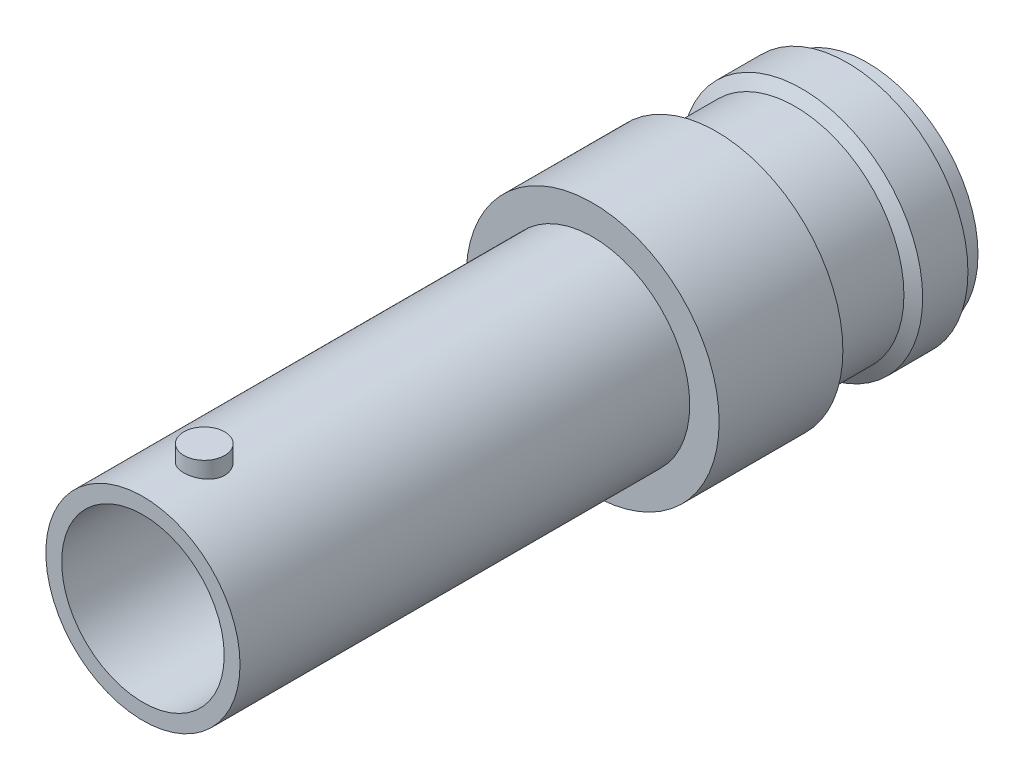
ISO-10303-21;
HEADER;
FILE_DESCRIPTION(('STEP AP214'),'2;1');
FILE_NAME('part.step','',(''),(''),'','','');
FILE_SCHEMA(('AUTOMOTIVE_DESIGN { 1 0 10303 214 1 1 1 1 }'));
ENDSEC;
DATA;
#1=APPLICATION_CONTEXT('core data for automotive mechanical design processes');
#2=APPLICATION_PROTOCOL_DEFINITION('international standard','automotive_design',2000,#1);
#3=PRODUCT_CONTEXT('',#1,'mechanical');
#4=PRODUCT('Part','Part','',(#3));
#5=PRODUCT_RELATED_PRODUCT_CATEGORY('part','',(#4));
#6=PRODUCT_DEFINITION_FORMATION('','',#4);
#7=PRODUCT_DEFINITION_CONTEXT('part definition',#1,'design');
#8=PRODUCT_DEFINITION('design','',#6,#7);
#9=PRODUCT_DEFINITION_SHAPE('','',#8);
#10=(LENGTH_UNIT() NAMED_UNIT(*) SI_UNIT(.MILLI.,.METRE.));
#11=(NAMED_UNIT(*) PLANE_ANGLE_UNIT() SI_UNIT($,.RADIAN.));
#12=(NAMED_UNIT(*) SI_UNIT($,.STERADIAN.) SOLID_ANGLE_UNIT());
#13=UNCERTAINTY_MEASURE_WITH_UNIT(LENGTH_MEASURE(1.E-05),#10,'distance_accuracy_value','');
#14=(GEOMETRIC_REPRESENTATION_CONTEXT(3) GLOBAL_UNCERTAINTY_ASSIGNED_CONTEXT((#13)) GLOBAL_UNIT_ASSIGNED_CONTEXT((#10,
#11,#12)) REPRESENTATION_CONTEXT('',''));
#15=CARTESIAN_POINT('',(0.,0.,0.));
#16=DIRECTION('',(0.,0.,1.));
#17=DIRECTION('',(1.,0.,0.));
#18=AXIS2_PLACEMENT_3D('',#15,#16,#17);
#19=CARTESIAN_POINT('',(0.,125.,108.947));
#20=DIRECTION('',(0.,0.,-1.));
#21=DIRECTION('',(0.00295311214486117,-0.999995639554823,0.));
#22=AXIS2_PLACEMENT_3D('',#19,#20,#21);
#23=TOROIDAL_SURFACE('',#22,5.548399999994,0.2286);
#24=CARTESIAN_POINT('',(0.,125.,109.1756));
#25=DIRECTION('',(0.,0.,1.));
#26=DIRECTION('',(-3.04320661187128E-12,-1.,0.));
#27=AXIS2_PLACEMENT_3D('',#24,#25,#26);
#28=CIRCLE('',#27,5.54839999999403);
#29=CARTESIAN_POINT('',(6.75102606196437E-12,130.548399999996,109.1756));
#30=VERTEX_POINT('',#29);
#31=CARTESIAN_POINT('',(-3.36996733686992E-12,119.451600000004,109.1756));
#32=VERTEX_POINT('',#31);
#33=EDGE_CURVE('E37',#30,#32,#28,.F.);
#34=ORIENTED_EDGE('',*,*,#33,.F.);
#35=CARTESIAN_POINT('',(0.,125.,109.1756));
#36=DIRECTION('',(0.,0.,1.));
#37=DIRECTION('',(3.04325363193974E-12,1.,0.));
#38=AXIS2_PLACEMENT_3D('',#35,#36,#37);
#39=CIRCLE('',#38,5.54839999999401);
#40=EDGE_CURVE('E34',#32,#30,#39,.F.);
#41=ORIENTED_EDGE('',*,*,#40,.F.);
#42=EDGE_LOOP('',(#34,#41));
#43=FACE_BOUND('',#42,.T.);
#44=CARTESIAN_POINT('',(0.,125.,108.946999999992));
#45=DIRECTION('',(0.,0.,-1.));
#46=DIRECTION('',(0.,1.,0.));
#47=AXIS2_PLACEMENT_3D('',#44,#45,#46);
#48=CIRCLE('',#47,5.77699999999998);
#49=CARTESIAN_POINT('',(0.,130.777,108.946999999992));
#50=VERTEX_POINT('',#49);
#51=EDGE_CURVE('E44',#50,#50,#48,.F.);
#52=ORIENTED_EDGE('',*,*,#51,.F.);
#53=EDGE_LOOP('',(#52));
#54=FACE_BOUND('',#53,.T.);
#55=ADVANCED_FACE('F16',(#43,#54),#23,.F.);
#56=CARTESIAN_POINT('',(-5.776118093564,119.229664,109.1756));
#57=DIRECTION('',(0.,0.,-1.));
#58=DIRECTION('',(0.,1.,0.));
#59=AXIS2_PLACEMENT_3D('',#56,#57,#58);
#60=PLANE('',#59);
#61=CARTESIAN_POINT('',(0.,125.,109.175599999977));
#62=DIRECTION('',(0.,0.,1.));
#63=DIRECTION('',(1.,0.,0.));
#64=AXIS2_PLACEMENT_3D('',#61,#62,#63);
#65=CIRCLE('',#64,5.41);
#66=CARTESIAN_POINT('',(5.41,125.,109.175599999977));
#67=VERTEX_POINT('',#66);
#68=EDGE_CURVE('E163',#67,#67,#65,.T.);
#69=ORIENTED_EDGE('',*,*,#68,.T.);
#70=EDGE_LOOP('',(#69));
#71=FACE_BOUND('',#70,.T.);
#72=ORIENTED_EDGE('',*,*,#33,.T.);
#73=ORIENTED_EDGE('',*,*,#40,.T.);
#74=EDGE_LOOP('',(#72,#73));
#75=FACE_BOUND('',#74,.T.);
#76=ADVANCED_FACE('F43',(#71,#75),#60,.T.);
#77=CARTESIAN_POINT('',(0.,125.,108.946999999992));
#78=DIRECTION('',(0.,0.,-1.));
#79=DIRECTION('',(-1.,0.,0.));
#80=AXIS2_PLACEMENT_3D('',#77,#78,#79);
#81=CYLINDRICAL_SURFACE('',#80,5.77699999999998);
#82=CARTESIAN_POINT('',(0.,125.,108.667600000008));
#83=DIRECTION('',(0.,0.,-1.));
#84=DIRECTION('',(-1.,0.,0.));
#85=AXIS2_PLACEMENT_3D('',#82,#83,#84);
#86=CIRCLE('',#85,5.77699999999998);
#87=CARTESIAN_POINT('',(-5.77699999999998,125.,108.667600000008));
#88=VERTEX_POINT('',#87);
#89=EDGE_CURVE('E160',#88,#88,#86,.T.);
#90=ORIENTED_EDGE('',*,*,#89,.T.);
#91=EDGE_LOOP('',(#90));
#92=FACE_BOUND('',#91,.T.);
#93=ORIENTED_EDGE('',*,*,#51,.T.);
#94=EDGE_LOOP('',(#93));
#95=FACE_BOUND('',#94,.T.);
#96=ADVANCED_FACE('F61',(#92,#95),#81,.F.);
#97=CARTESIAN_POINT('',(0.,125.,104.758236658823));
#98=DIRECTION('',(0.,0.,1.));
#99=DIRECTION('',(1.,0.,0.));
#100=AXIS2_PLACEMENT_3D('',#97,#98,#99);
#101=CYLINDRICAL_SURFACE('',#100,5.41);
#102=ORIENTED_EDGE('',*,*,#68,.F.);
#103=EDGE_LOOP('',(#102));
#104=FACE_BOUND('',#103,.T.);
#105=CARTESIAN_POINT('',(0.,125.,104.758236658796));
#106=DIRECTION('',(0.,0.,1.));
#107=DIRECTION('',(0.,-1.,0.));
#108=AXIS2_PLACEMENT_3D('',#105,#106,#107);
#109=CIRCLE('',#108,5.40999999999343);
#110=CARTESIAN_POINT('',(0.,119.590000000007,104.758236658796));
#111=VERTEX_POINT('',#110);
#112=EDGE_CURVE('E167',#111,#111,#109,.T.);
#113=ORIENTED_EDGE('',*,*,#112,.T.);
#114=EDGE_LOOP('',(#113));
#115=FACE_BOUND('',#114,.T.);
#116=ADVANCED_FACE('F71',(#104,#115),#101,.T.);
#117=CARTESIAN_POINT('',(-6.5364,131.5364,108.6676));
#118=DIRECTION('',(0.,0.,1.));
#119=DIRECTION('',(0.,-1.,0.));
#120=AXIS2_PLACEMENT_3D('',#117,#118,#119);
#121=PLANE('',#120);
#122=ORIENTED_EDGE('',*,*,#89,.F.);
#123=EDGE_LOOP('',(#122));
#124=FACE_BOUND('',#123,.T.);
#125=CARTESIAN_POINT('',(0.,125.,108.6676));
#126=DIRECTION('',(0.,0.,1.));
#127=DIRECTION('',(1.,0.,0.));
#128=AXIS2_PLACEMENT_3D('',#125,#126,#127);
#129=CIRCLE('',#128,6.28499999999999);
#130=CARTESIAN_POINT('',(6.28499999999999,125.,108.6676));
#131=VERTEX_POINT('',#130);
#132=EDGE_CURVE('E179',#131,#131,#129,.F.);
#133=ORIENTED_EDGE('',*,*,#132,.T.);
#134=EDGE_LOOP('',(#133));
#135=FACE_BOUND('',#134,.T.);
#136=ADVANCED_FACE('F66',(#124,#135),#121,.F.);
#137=CARTESIAN_POINT('',(0.,125.,104.417600000004));
#138=DIRECTION('',(0.,0.,-1.));
#139=DIRECTION('',(-1.,0.,0.));
#140=AXIS2_PLACEMENT_3D('',#137,#138,#139);
#141=CONICAL_SURFACE('',#140,6.00000000000654,1.04719755124326);
#142=ORIENTED_EDGE('',*,*,#112,.F.);
#143=EDGE_LOOP('',(#142));
#144=FACE_BOUND('',#143,.T.);
#145=CARTESIAN_POINT('',(0.,125.,104.417599999989));
#146=DIRECTION('',(0.,0.,1.));
#147=DIRECTION('',(0.,-1.,0.));
#148=AXIS2_PLACEMENT_3D('',#145,#146,#147);
#149=CIRCLE('',#148,5.99999999999998);
#150=CARTESIAN_POINT('',(0.,119.,104.417599999989));
#151=VERTEX_POINT('',#150);
#152=EDGE_CURVE('E180',#151,#151,#149,.T.);
#153=ORIENTED_EDGE('',*,*,#152,.T.);
#154=EDGE_LOOP('',(#153));
#155=FACE_BOUND('',#154,.T.);
#156=ADVANCED_FACE('F70',(#144,#155),#141,.T.);
#157=CARTESIAN_POINT('',(1.064179810211,130.5753,135.1866776728));
#158=DIRECTION('',(0.,-1.,0.));
#159=DIRECTION('',(-1.,0.,0.));
#160=AXIS2_PLACEMENT_3D('',#157,#158,#159);
#161=PLANE('',#160);
#162=CARTESIAN_POINT('',(0.,130.57529999999,134.1196));
#163=DIRECTION('',(0.,-1.,0.));
#164=DIRECTION('',(0.,0.,-1.));
#165=AXIS2_PLACEMENT_3D('',#162,#163,#164);
#166=CIRCLE('',#165,1.016);
#167=CARTESIAN_POINT('',(0.,130.57529999999,133.1036));
#168=VERTEX_POINT('',#167);
#169=EDGE_CURVE('E182',#168,#168,#166,.F.);
#170=ORIENTED_EDGE('',*,*,#169,.T.);
#171=EDGE_LOOP('',(#170));
#172=FACE_BOUND('',#171,.T.);
#173=ADVANCED_FACE('F73',(#172),#161,.F.);
#174=CARTESIAN_POINT('',(-1.064179810211,119.4247,135.1866776728));
#175=DIRECTION('',(0.,1.,0.));
#176=DIRECTION('',(1.,0.,0.));
#177=AXIS2_PLACEMENT_3D('',#174,#175,#176);
#178=PLANE('',#177);
#179=CARTESIAN_POINT('',(0.,119.42470000001,134.1196));
#180=DIRECTION('',(0.,1.,0.));
#181=DIRECTION('',(0.,0.,1.));
#182=AXIS2_PLACEMENT_3D('',#179,#180,#181);
#183=CIRCLE('',#182,1.016);
#184=CARTESIAN_POINT('',(0.,119.42470000001,135.1356));
#185=VERTEX_POINT('',#184);
#186=EDGE_CURVE('E186',#185,#185,#183,.F.);
#187=ORIENTED_EDGE('',*,*,#186,.T.);
#188=EDGE_LOOP('',(#187));
#189=FACE_BOUND('',#188,.T.);
#190=ADVANCED_FACE('F76',(#189),#178,.F.);
#191=CARTESIAN_POINT('',(0.,125.,108.6676));
#192=DIRECTION('',(0.,0.,1.));
#193=DIRECTION('',(1.,0.,0.));
#194=AXIS2_PLACEMENT_3D('',#191,#192,#193);
#195=CYLINDRICAL_SURFACE('',#194,6.28499999999999);
#196=ORIENTED_EDGE('',*,*,#132,.F.);
#197=EDGE_LOOP('',(#196));
#198=FACE_BOUND('',#197,.T.);
#199=CARTESIAN_POINT('',(0.,125.,114.8176));
#200=DIRECTION('',(0.,0.,1.));
#201=DIRECTION('',(1.,0.,0.));
#202=AXIS2_PLACEMENT_3D('',#199,#200,#201);
#203=CIRCLE('',#202,6.28499999999999);
#204=CARTESIAN_POINT('',(6.28499999999999,125.,114.8176));
#205=VERTEX_POINT('',#204);
#206=EDGE_CURVE('E195',#205,#205,#203,.T.);
#207=ORIENTED_EDGE('',*,*,#206,.F.);
#208=EDGE_LOOP('',(#207));
#209=FACE_BOUND('',#208,.T.);
#210=ADVANCED_FACE('F80',(#198,#209),#195,.T.);
#211=CARTESIAN_POINT('',(0.,125.,102.167600000011));
#212=DIRECTION('',(0.,0.,1.));
#213=DIRECTION('',(1.,0.,0.));
#214=AXIS2_PLACEMENT_3D('',#211,#212,#213);
#215=CYLINDRICAL_SURFACE('',#214,5.99999999999998);
#216=ORIENTED_EDGE('',*,*,#152,.F.);
#217=EDGE_LOOP('',(#216));
#218=FACE_BOUND('',#217,.T.);
#219=CARTESIAN_POINT('',(0.,125.,102.167600000011));
#220=DIRECTION('',(0.,0.,1.));
#221=DIRECTION('',(1.,0.,0.));
#222=AXIS2_PLACEMENT_3D('',#219,#220,#221);
#223=CIRCLE('',#222,5.99999999999998);
#224=CARTESIAN_POINT('',(5.99999999999998,125.,102.167600000011));
#225=VERTEX_POINT('',#224);
#226=EDGE_CURVE('E134',#225,#225,#223,.T.);
#227=ORIENTED_EDGE('',*,*,#226,.T.);
#228=EDGE_LOOP('',(#227));
#229=FACE_BOUND('',#228,.T.);
#230=ADVANCED_FACE('F140',(#218,#229),#215,.T.);
#231=CARTESIAN_POINT('',(0.,130.57529999999,134.1196));
#232=DIRECTION('',(0.,-1.,0.));
#233=DIRECTION('',(0.,0.,-1.));
#234=AXIS2_PLACEMENT_3D('',#231,#232,#233);
#235=CYLINDRICAL_SURFACE('',#234,1.016);
#236=ORIENTED_EDGE('',*,*,#169,.F.);
#237=EDGE_LOOP('',(#236));
#238=FACE_BOUND('',#237,.T.);
#239=CARTESIAN_POINT('',(-1.016,129.716817677206,134.1196));
#240=CARTESIAN_POINT('',(-1.01599753819545,129.71681905962,134.175973482995));
#241=CARTESIAN_POINT('',(-1.01129116529682,129.717839561402,134.232380824522));
#242=CARTESIAN_POINT('',(-0.992604830319833,129.721805605104,134.343605233774));
#243=CARTESIAN_POINT('',(-0.978615436002373,129.724753104951,134.39842062477));
#244=CARTESIAN_POINT('',(-0.941819878725128,129.732224647349,134.504821698965));
#245=CARTESIAN_POINT('',(-0.919023759257698,129.736746893428,134.55641098374));
#246=CARTESIAN_POINT('',(-0.865289887374997,129.746856051227,134.655028086775));
#247=CARTESIAN_POINT('',(-0.834353118237664,129.752442834344,134.702056454994));
#248=CARTESIAN_POINT('',(-0.764701391869929,129.764149246084,134.79095744115));
#249=CARTESIAN_POINT('',(-0.725883632414589,129.770275237966,134.832748687993));
#250=CARTESIAN_POINT('',(-0.641782659176417,129.782315453194,134.909286271325));
#251=CARTESIAN_POINT('',(-0.596497588879713,129.78822961512,134.944030577957));
#252=CARTESIAN_POINT('',(-0.500195157768454,129.799249992103,135.005809467447));
#253=CARTESIAN_POINT('',(-0.449124404827367,129.804347421346,135.032762436059));
#254=CARTESIAN_POINT('',(-0.343087425645694,129.81307949253,135.077646913284));
#255=CARTESIAN_POINT('',(-0.288125710148578,129.816715796701,135.095588679224));
#256=CARTESIAN_POINT('',(-0.194065456196328,129.82124631804,135.117657642166));
#257=CARTESIAN_POINT('',(-0.155579052871762,129.822646894119,135.124375306635));
#258=CARTESIAN_POINT('',(-0.078067162623382,129.824524165111,135.133347283278));
#259=CARTESIAN_POINT('',(-0.0390416877788785,129.825000880693,135.1356016953));
#260=CARTESIAN_POINT('',(0.0563890923518721,129.824998727989,135.135597551427));
#261=CARTESIAN_POINT('',(0.112812006344453,129.824001147166,135.13088865994));
#262=CARTESIAN_POINT('',(0.224068794776081,129.820116818885,135.112191410316));
#263=CARTESIAN_POINT('',(0.278901004687347,129.817228162124,135.098193673612));
#264=CARTESIAN_POINT('',(0.385337685680657,129.809883915948,135.061373730733));
#265=CARTESIAN_POINT('',(0.436945616944351,129.805430041512,135.038561180067));
#266=CARTESIAN_POINT('',(0.535594180695215,129.795437957855,134.984788573121));
#267=CARTESIAN_POINT('',(0.58263538514952,129.789899884689,134.953829538967));
#268=CARTESIAN_POINT('',(0.671522809463308,129.778254986962,134.884154930189));
#269=CARTESIAN_POINT('',(0.713291508478634,129.772141570681,134.845341555477));
#270=CARTESIAN_POINT('',(0.789785302352214,129.760080631052,134.761258934828));
#271=CARTESIAN_POINT('',(0.824508298216955,129.754133157595,134.715987771864));
#272=CARTESIAN_POINT('',(0.886264165442976,129.743011558089,134.619698413625));
#273=CARTESIAN_POINT('',(0.913211703312222,129.737846288888,134.568624433809));
#274=CARTESIAN_POINT('',(0.958085218023479,129.728977246538,134.462580519358));
#275=CARTESIAN_POINT('',(0.976021528025808,129.725271800468,134.40761512993));
#276=CARTESIAN_POINT('',(0.998075520016733,129.720651320679,134.313569263921));
#277=CARTESIAN_POINT('',(1.00478644330444,129.719221373548,134.275102183807));
#278=CARTESIAN_POINT('',(1.01374948128344,129.717304084777,134.197628801617));
#279=CARTESIAN_POINT('',(1.01600170409552,129.716816720279,134.158622512639));
#280=CARTESIAN_POINT('',(1.01599753819544,129.71681905962,134.063226517005));
#281=CARTESIAN_POINT('',(1.01129116529681,129.717839561402,134.006819175478));
#282=CARTESIAN_POINT('',(0.992604830319797,129.721805605104,133.895594766226));
#283=CARTESIAN_POINT('',(0.978615436002328,129.724753104951,133.84077937523));
#284=CARTESIAN_POINT('',(0.94181987872506,129.732224647349,133.734378301035));
#285=CARTESIAN_POINT('',(0.919023759257616,129.736746893428,133.68278901626));
#286=CARTESIAN_POINT('',(0.865289887374899,129.746856051227,133.584171913224));
#287=CARTESIAN_POINT('',(0.834353118237562,129.752442834344,133.537143545006));
#288=CARTESIAN_POINT('',(0.764701391869812,129.764149246084,133.44824255885));
#289=CARTESIAN_POINT('',(0.725883632414461,129.770275237966,133.406451312007));
#290=CARTESIAN_POINT('',(0.64178265917627,129.782315453194,133.329913728675));
#291=CARTESIAN_POINT('',(0.59649758887956,129.78822961512,133.295169422043));
#292=CARTESIAN_POINT('',(0.500195157768288,129.799249992103,133.233390532552));
#293=CARTESIAN_POINT('',(0.449124404827193,129.804347421346,133.206437563941));
#294=CARTESIAN_POINT('',(0.343087425645516,129.81307949253,133.161553086716));
#295=CARTESIAN_POINT('',(0.288125710148405,129.816715796701,133.143611320776));
#296=CARTESIAN_POINT('',(0.194065456196302,129.82124631804,133.121542357834));
#297=CARTESIAN_POINT('',(0.155579052871883,129.822646894119,133.114824693365));
#298=CARTESIAN_POINT('',(0.0780671626238007,129.824524165111,133.105852716722));
#299=CARTESIAN_POINT('',(0.0390416877794484,129.825000880693,133.1035983047));
#300=CARTESIAN_POINT('',(-0.0563890923511513,129.824998727989,133.103602448573));
#301=CARTESIAN_POINT('',(-0.112812006343736,129.824001147167,133.10831134006));
#302=CARTESIAN_POINT('',(-0.224068794775372,129.820116818885,133.127008589684));
#303=CARTESIAN_POINT('',(-0.278901004686642,129.817228162124,133.141006326388));
#304=CARTESIAN_POINT('',(-0.385337685679984,129.809883915948,133.177826269266));
#305=CARTESIAN_POINT('',(-0.436945616943706,129.805430041512,133.200638819932));
#306=CARTESIAN_POINT('',(-0.535594180694611,129.795437957855,133.254411426879));
#307=CARTESIAN_POINT('',(-0.58263538514893,129.789899884689,133.285370461033));
#308=CARTESIAN_POINT('',(-0.67152280946276,129.778254986962,133.35504506981));
#309=CARTESIAN_POINT('',(-0.713291508478113,129.772141570681,133.393858444523));
#310=CARTESIAN_POINT('',(-0.789785302351746,129.760080631052,133.477941065172));
#311=CARTESIAN_POINT('',(-0.824508298216514,129.754133157595,133.523212228135));
#312=CARTESIAN_POINT('',(-0.886264165442602,129.743011558089,133.619501586374));
#313=CARTESIAN_POINT('',(-0.913211703311887,129.737846288888,133.67057556619));
#314=CARTESIAN_POINT('',(-0.958085218023223,129.728977246538,133.776619480642));
#315=CARTESIAN_POINT('',(-0.976021528025591,129.725271800468,133.831584870069));
#316=CARTESIAN_POINT('',(-0.998075520016606,129.720651320679,133.925630736079));
#317=CARTESIAN_POINT('',(-1.00478644330435,129.719221373548,133.964097816192));
#318=CARTESIAN_POINT('',(-1.01374948128342,129.717304084777,134.041571198383));
#319=CARTESIAN_POINT('',(-1.01600170409551,129.716816720279,134.080577487361));
#320=CARTESIAN_POINT('',(-1.016,129.716817677206,134.1196));
#321=B_SPLINE_CURVE_WITH_KNOTS('',3,(#239,#240,#241,#242,#243,#244,#245,#246,#247,#248,#249,
#250,#251,#252,#253,#254,#255,#256,#257,#258,#259,#260,#261,#262,#263,#264,#265,#266,#267,#268,
#269,#270,#271,#272,#273,#274,#275,#276,#277,#278,#279,#280,#281,#282,#283,#284,#285,#286,#287,
#288,#289,#290,#291,#292,#293,#294,#295,#296,#297,#298,#299,#300,#301,#302,#303,#304,#305,#306,
#307,#308,#309,#310,#311,#312,#313,#314,#315,#316,#317,#318,#319,#320),.UNSPECIFIED.,.T.,.F.,(4,
2,2,2,2,2,2,2,2,2,2,2,2,2,2,2,2,2,2,2,2,2,2,2,2,2,2,2,2,2,2,2,2,2,2,2,2,2,2,2,4),(0.,
0.16897643837371,0.338124832793392,0.507080891316996,0.676016551644549,0.847316607287546,
1.01866593573821,1.19175000221518,1.36463660046329,1.48166463193941,1.59869004533597,
1.76771339496098,1.93690766071118,2.10591711861919,2.27490538127866,2.44614397755186,
2.61743351305551,2.79053702416587,2.96344158209828,3.0804122703583,3.19738012211554,
3.36635656048925,3.53550495490894,3.70446101343253,3.8733966737601,4.04469672940312,
4.21604605785378,4.38913012433076,4.56201672257884,4.67904475405451,4.79607016745063,
4.96509351707563,5.13428778282584,5.30329724073385,5.4722855033933,5.64352409966652,
5.81481363517015,5.9879171462805,6.16082170421289,6.27779239247318,6.39476024423075),.UNSPECIFIED.);
#322=CARTESIAN_POINT('',(-1.016,129.716817677206,134.1196));
#323=VERTEX_POINT('',#322);
#324=EDGE_CURVE('E128',#323,#323,#321,.T.);
#325=ORIENTED_EDGE('',*,*,#324,.T.);
#326=EDGE_LOOP('',(#325));
#327=FACE_BOUND('',#326,.T.);
#328=ADVANCED_FACE('F136',(#238,#327),#235,.T.);
#329=CARTESIAN_POINT('',(0.,119.42470000001,134.1196));
#330=DIRECTION('',(0.,1.,0.));
#331=DIRECTION('',(0.,0.,1.));
#332=AXIS2_PLACEMENT_3D('',#329,#330,#331);
#333=CYLINDRICAL_SURFACE('',#332,1.016);
#334=ORIENTED_EDGE('',*,*,#186,.F.);
#335=EDGE_LOOP('',(#334));
#336=FACE_BOUND('',#335,.T.);
#337=CARTESIAN_POINT('',(-4.81524704204527E-13,120.175,133.1036));
#338=CARTESIAN_POINT('',(0.0563890923509133,120.175001272011,133.103602448573));
#339=CARTESIAN_POINT('',(0.112812006343497,120.175998852833,133.10831134006));
#340=CARTESIAN_POINT('',(0.224068794775137,120.179883181115,133.127008589684));
#341=CARTESIAN_POINT('',(0.278901004686414,120.182771837876,133.141006326388));
#342=CARTESIAN_POINT('',(0.385337685679763,120.190116084052,133.177826269266));
#343=CARTESIAN_POINT('',(0.436945616943486,120.194569958488,133.200638819932));
#344=CARTESIAN_POINT('',(0.535594180694407,120.204562042145,133.254411426879));
#345=CARTESIAN_POINT('',(0.58263538514874,120.210100115311,133.285370461033));
#346=CARTESIAN_POINT('',(0.671522809462585,120.221745013038,133.35504506981));
#347=CARTESIAN_POINT('',(0.71329150847794,120.227858429319,133.393858444523));
#348=CARTESIAN_POINT('',(0.789785302351591,120.239919368948,133.477941065172));
#349=CARTESIAN_POINT('',(0.824508298216374,120.245866842405,133.523212228135));
#350=CARTESIAN_POINT('',(0.886264165442488,120.256988441911,133.619501586374));
#351=CARTESIAN_POINT('',(0.913211703311782,120.262153711112,133.67057556619));
#352=CARTESIAN_POINT('',(0.95808521802314,120.271022753462,133.776619480641));
#353=CARTESIAN_POINT('',(0.976021528025521,120.274728199532,133.831584870069));
#354=CARTESIAN_POINT('',(0.998075520016568,120.279348679321,133.925630736078));
#355=CARTESIAN_POINT('',(1.00478644330433,120.280778626452,133.964097816192));
#356=CARTESIAN_POINT('',(1.01374948128341,120.282695915223,134.041571198383));
#357=CARTESIAN_POINT('',(1.01600170409551,120.283183279721,134.080577487361));
#358=CARTESIAN_POINT('',(1.01599753819545,120.28318094038,134.175973482995));
#359=CARTESIAN_POINT('',(1.01129116529682,120.282160438598,134.232380824522));
#360=CARTESIAN_POINT('',(0.992604830319829,120.278194394896,134.343605233774));
#361=CARTESIAN_POINT('',(0.97861543600237,120.275246895049,134.39842062477));
#362=CARTESIAN_POINT('',(0.941819878725128,120.267775352651,134.504821698965));
#363=CARTESIAN_POINT('',(0.919023759257698,120.263253106572,134.55641098374));
#364=CARTESIAN_POINT('',(0.865289887374998,120.253143948773,134.655028086775));
#365=CARTESIAN_POINT('',(0.834353118237665,120.247557165656,134.702056454994));
#366=CARTESIAN_POINT('',(0.764701391869929,120.235850753916,134.79095744115));
#367=CARTESIAN_POINT('',(0.725883632414589,120.229724762034,134.832748687993));
#368=CARTESIAN_POINT('',(0.641782659176417,120.217684546806,134.909286271325));
#369=CARTESIAN_POINT('',(0.596497588879713,120.21177038488,134.944030577957));
#370=CARTESIAN_POINT('',(0.500195157768451,120.200750007897,135.005809467447));
#371=CARTESIAN_POINT('',(0.44912440482736,120.195652578654,135.032762436059));
#372=CARTESIAN_POINT('',(0.343087425645686,120.18692050747,135.077646913284));
#373=CARTESIAN_POINT('',(0.288125710148575,120.183284203299,135.095588679224));
#374=CARTESIAN_POINT('',(0.194065456196275,120.17875368196,135.117657642166));
#375=CARTESIAN_POINT('',(0.155579052871655,120.177353105881,135.124375306635));
#376=CARTESIAN_POINT('',(0.0780671626231683,120.175475834889,135.133347283278));
#377=CARTESIAN_POINT('',(0.0390416877786122,120.174999119307,135.1356016953));
#378=CARTESIAN_POINT('',(-0.0563890923521915,120.175001272011,135.135597551427));
#379=CARTESIAN_POINT('',(-0.112812006344773,120.175998852834,135.13088865994));
#380=CARTESIAN_POINT('',(-0.224068794776399,120.179883181115,135.112191410316));
#381=CARTESIAN_POINT('',(-0.278901004687664,120.182771837876,135.098193673612));
#382=CARTESIAN_POINT('',(-0.385337685680966,120.190116084052,135.061373730733));
#383=CARTESIAN_POINT('',(-0.436945616944655,120.194569958488,135.038561180067));
#384=CARTESIAN_POINT('',(-0.535594180695507,120.204562042145,134.98478857312));
#385=CARTESIAN_POINT('',(-0.582635385149806,120.210100115311,134.953829538966));
#386=CARTESIAN_POINT('',(-0.671522809463565,120.221745013038,134.884154930189));
#387=CARTESIAN_POINT('',(-0.713291508478867,120.227858429319,134.845341555477));
#388=CARTESIAN_POINT('',(-0.789785302352414,120.239919368948,134.761258934827));
#389=CARTESIAN_POINT('',(-0.824508298217144,120.245866842405,134.715987771864));
#390=CARTESIAN_POINT('',(-0.886264165443142,120.256988441912,134.619698413625));
#391=CARTESIAN_POINT('',(-0.913211703312376,120.262153711112,134.568624433809));
#392=CARTESIAN_POINT('',(-0.958085218023599,120.271022753462,134.462580519357));
#393=CARTESIAN_POINT('',(-0.976021528025907,120.274728199532,134.40761512993));
#394=CARTESIAN_POINT('',(-0.998075520016802,120.279348679321,134.31356926392));
#395=CARTESIAN_POINT('',(-1.0047864433045,120.280778626452,134.275102183807));
#396=CARTESIAN_POINT('',(-1.01374948128348,120.282695915223,134.197628801616));
#397=CARTESIAN_POINT('',(-1.01600170409553,120.283183279721,134.158622512638));
#398=CARTESIAN_POINT('',(-1.01599753819541,120.28318094038,134.063226517005));
#399=CARTESIAN_POINT('',(-1.01129116529675,120.282160438598,134.006819175478));
#400=CARTESIAN_POINT('',(-0.992604830319696,120.278194394896,133.895594766225));
#401=CARTESIAN_POINT('',(-0.978615436002198,120.275246895049,133.84077937523));
#402=CARTESIAN_POINT('',(-0.941819878724884,120.267775352651,133.734378301034));
#403=CARTESIAN_POINT('',(-0.919023759257424,120.263253106572,133.68278901626));
#404=CARTESIAN_POINT('',(-0.865289887374664,120.253143948773,133.584171913224));
#405=CARTESIAN_POINT('',(-0.834353118237301,120.247557165656,133.537143545005));
#406=CARTESIAN_POINT('',(-0.764701391869506,120.235850753916,133.448242558849));
#407=CARTESIAN_POINT('',(-0.725883632414136,120.229724762034,133.406451312006));
#408=CARTESIAN_POINT('',(-0.64178265917591,120.217684546806,133.329913728674));
#409=CARTESIAN_POINT('',(-0.596497588879185,120.21177038488,133.295169422043));
#410=CARTESIAN_POINT('',(-0.500195157767885,120.200750007897,133.233390532552));
#411=CARTESIAN_POINT('',(-0.449124404826778,120.195652578654,133.206437563941));
#412=CARTESIAN_POINT('',(-0.343087425645075,120.18692050747,133.161553086715));
#413=CARTESIAN_POINT('',(-0.288125710147949,120.183284203299,133.143611320776));
#414=CARTESIAN_POINT('',(-0.194065456195943,120.17875368196,133.121542357834));
#415=CARTESIAN_POINT('',(-0.15557905287164,120.177353105881,133.114824693365));
#416=CARTESIAN_POINT('',(-0.0780671626237952,120.175475834889,133.105852716722));
#417=CARTESIAN_POINT('',(-0.0390416877795638,120.174999119307,133.1035983047));
#418=CARTESIAN_POINT('',(-4.81524704204527E-13,120.175,133.1036));
#419=B_SPLINE_CURVE_WITH_KNOTS('',3,(#337,#338,#339,#340,#341,#342,#343,#344,#345,#346,#347,
#348,#349,#350,#351,#352,#353,#354,#355,#356,#357,#358,#359,#360,#361,#362,#363,#364,#365,#366,
#367,#368,#369,#370,#371,#372,#373,#374,#375,#376,#377,#378,#379,#380,#381,#382,#383,#384,#385,
#386,#387,#388,#389,#390,#391,#392,#393,#394,#395,#396,#397,#398,#399,#400,#401,#402,#403,#404,
#405,#406,#407,#408,#409,#410,#411,#412,#413,#414,#415,#416,#417,#418),.UNSPECIFIED.,.T.,.F.,(4,
2,2,2,2,2,2,2,2,2,2,2,2,2,2,2,2,2,2,2,2,2,2,2,2,2,2,2,2,2,2,2,2,2,2,2,2,2,2,2,4),(0.,
0.169023349624996,0.338217615375199,0.507227073283215,0.676215335942669,0.847453932215882,
1.01874346771952,1.19184697882985,1.36475153676223,1.48172222502266,1.59869007678035,
1.76766651515409,1.93681490957374,2.10577096809734,2.2747066284249,2.44600668406789,
2.61735601251856,2.79044007899554,2.96332667724364,3.08035470871991,3.19738012211664,
3.36640347174165,3.53559773749186,3.70460719539989,3.87359545805934,4.04483405433253,
4.21612358983621,4.38922710094658,4.56213165887897,4.67910234713903,4.79607019889635,
4.96504663727004,5.13419503168975,5.30315109021334,5.4720867505409,5.64338680618392,
5.81473613463459,5.98782020111155,6.16070679935967,6.27773483083498,6.39476024423074),.UNSPECIFIED.);
#420=CARTESIAN_POINT('',(-4.81524704204527E-13,120.175,133.1036));
#421=VERTEX_POINT('',#420);
#422=EDGE_CURVE('E122',#421,#421,#419,.T.);
#423=ORIENTED_EDGE('',*,*,#422,.T.);
#424=EDGE_LOOP('',(#423));
#425=FACE_BOUND('',#424,.T.);
#426=ADVANCED_FACE('F86',(#336,#425),#333,.T.);
#427=CARTESIAN_POINT('',(-6.5364,131.5364,114.8176));
#428=DIRECTION('',(0.,0.,1.));
#429=DIRECTION('',(0.,-1.,0.));
#430=AXIS2_PLACEMENT_3D('',#427,#428,#429);
#431=PLANE('',#430);
#432=CARTESIAN_POINT('',(0.,125.,114.8176));
#433=DIRECTION('',(0.,0.,1.));
#434=DIRECTION('',(1.,0.,0.));
#435=AXIS2_PLACEMENT_3D('',#432,#433,#434);
#436=CIRCLE('',#435,4.82500000000002);
#437=CARTESIAN_POINT('',(4.82500000000002,125.,114.8176));
#438=VERTEX_POINT('',#437);
#439=EDGE_CURVE('E211',#438,#438,#436,.F.);
#440=ORIENTED_EDGE('',*,*,#439,.T.);
#441=EDGE_LOOP('',(#440));
#442=FACE_BOUND('',#441,.T.);
#443=ORIENTED_EDGE('',*,*,#206,.T.);
#444=EDGE_LOOP('',(#443));
#445=FACE_BOUND('',#444,.T.);
#446=ADVANCED_FACE('F82',(#442,#445),#431,.T.);
#447=CARTESIAN_POINT('',(-6.24,131.24,102.1676));
#448=DIRECTION('',(0.,0.,1.));
#449=DIRECTION('',(0.,-1.,0.));
#450=AXIS2_PLACEMENT_3D('',#447,#448,#449);
#451=PLANE('',#450);
#452=CARTESIAN_POINT('',(0.,125.,102.16759999999));
#453=DIRECTION('',(0.,0.,1.));
#454=DIRECTION('',(1.,0.,0.));
#455=AXIS2_PLACEMENT_3D('',#452,#453,#454);
#456=CIRCLE('',#455,5.49999999999999);
#457=CARTESIAN_POINT('',(5.49999999999999,125.,102.16759999999));
#458=VERTEX_POINT('',#457);
#459=EDGE_CURVE('E213',#458,#458,#456,.T.);
#460=ORIENTED_EDGE('',*,*,#459,.T.);
#461=EDGE_LOOP('',(#460));
#462=FACE_BOUND('',#461,.T.);
#463=ORIENTED_EDGE('',*,*,#226,.F.);
#464=EDGE_LOOP('',(#463));
#465=FACE_BOUND('',#464,.T.);
#466=ADVANCED_FACE('F85',(#462,#465),#451,.F.);
#467=CARTESIAN_POINT('',(0.,125.,114.8176));
#468=DIRECTION('',(0.,0.,1.));
#469=DIRECTION('',(1.,0.,0.));
#470=AXIS2_PLACEMENT_3D('',#467,#468,#469);
#471=CYLINDRICAL_SURFACE('',#470,4.82500000000002);
#472=CARTESIAN_POINT('',(0.,125.,137.167599999999));
#473=DIRECTION('',(0.,0.,1.));
#474=DIRECTION('',(1.,0.,0.));
#475=AXIS2_PLACEMENT_3D('',#472,#473,#474);
#476=CIRCLE('',#475,4.82500000000002);
#477=CARTESIAN_POINT('',(4.82500000000005,125.,137.167599999999));
#478=VERTEX_POINT('',#477);
#479=EDGE_CURVE('E216',#478,#478,#476,.T.);
#480=ORIENTED_EDGE('',*,*,#479,.F.);
#481=EDGE_LOOP('',(#480));
#482=FACE_BOUND('',#481,.T.);
#483=ORIENTED_EDGE('',*,*,#324,.F.);
#484=EDGE_LOOP('',(#483));
#485=FACE_BOUND('',#484,.T.);
#486=ORIENTED_EDGE('',*,*,#439,.F.);
#487=EDGE_LOOP('',(#486));
#488=FACE_BOUND('',#487,.T.);
#489=ORIENTED_EDGE('',*,*,#422,.F.);
#490=EDGE_LOOP('',(#489));
#491=FACE_BOUND('',#490,.T.);
#492=ADVANCED_FACE('F89',(#482,#485,#488,#491),#471,.T.);
#493=CARTESIAN_POINT('',(0.,125.,101.16760000001));
#494=DIRECTION('',(0.,0.,1.));
#495=DIRECTION('',(1.,0.,0.));
#496=AXIS2_PLACEMENT_3D('',#493,#494,#495);
#497=CYLINDRICAL_SURFACE('',#496,5.49999999999999);
#498=ORIENTED_EDGE('',*,*,#459,.F.);
#499=EDGE_LOOP('',(#498));
#500=FACE_BOUND('',#499,.T.);
#501=CARTESIAN_POINT('',(0.,125.,101.16760000001));
#502=DIRECTION('',(0.,0.,1.));
#503=DIRECTION('',(1.,0.,0.));
#504=AXIS2_PLACEMENT_3D('',#501,#502,#503);
#505=CIRCLE('',#504,5.49999999999999);
#506=CARTESIAN_POINT('',(5.49999999999999,125.,101.16760000001));
#507=VERTEX_POINT('',#506);
#508=EDGE_CURVE('E221',#507,#507,#505,.T.);
#509=ORIENTED_EDGE('',*,*,#508,.T.);
#510=EDGE_LOOP('',(#509));
#511=FACE_BOUND('',#510,.T.);
#512=ADVANCED_FACE('F93',(#500,#511),#497,.T.);
#513=CARTESIAN_POINT('',(-5.02424396227,130.018,137.1676));
#514=DIRECTION('',(0.,0.,1.));
#515=DIRECTION('',(0.,-1.,0.));
#516=AXIS2_PLACEMENT_3D('',#513,#514,#515);
#517=PLANE('',#516);
#518=CARTESIAN_POINT('',(0.,125.,137.167599999999));
#519=DIRECTION('',(0.,0.,1.));
#520=DIRECTION('',(1.,0.,0.));
#521=AXIS2_PLACEMENT_3D('',#518,#519,#520);
#522=CIRCLE('',#521,4.03860000000003);
#523=CARTESIAN_POINT('',(4.03860000000009,125.,137.167599999999));
#524=VERTEX_POINT('',#523);
#525=EDGE_CURVE('E28',#524,#524,#522,.T.);
#526=ORIENTED_EDGE('',*,*,#525,.F.);
#527=EDGE_LOOP('',(#526));
#528=FACE_BOUND('',#527,.T.);
#529=ORIENTED_EDGE('',*,*,#479,.T.);
#530=EDGE_LOOP('',(#529));
#531=FACE_BOUND('',#530,.T.);
#532=ADVANCED_FACE('F91',(#528,#531),#517,.T.);
#533=CARTESIAN_POINT('',(-5.727117469945,130.72,101.1676));
#534=DIRECTION('',(0.,0.,1.));
#535=DIRECTION('',(0.,-1.,0.));
#536=AXIS2_PLACEMENT_3D('',#533,#534,#535);
#537=PLANE('',#536);
#538=CARTESIAN_POINT('',(0.,125.,101.1676));
#539=DIRECTION('',(0.,0.,1.));
#540=DIRECTION('',(1.,0.,0.));
#541=AXIS2_PLACEMENT_3D('',#538,#539,#540);
#542=CIRCLE('',#541,4.03860000000003);
#543=CARTESIAN_POINT('',(4.03860000000003,125.,101.1676));
#544=VERTEX_POINT('',#543);
#545=EDGE_CURVE('E11',#544,#544,#542,.F.);
#546=ORIENTED_EDGE('',*,*,#545,.F.);
#547=EDGE_LOOP('',(#546));
#548=FACE_BOUND('',#547,.T.);
#549=ORIENTED_EDGE('',*,*,#508,.F.);
#550=EDGE_LOOP('',(#549));
#551=FACE_BOUND('',#550,.T.);
#552=ADVANCED_FACE('F18',(#548,#551),#537,.F.);
#553=CARTESIAN_POINT('',(0.,125.,101.1676));
#554=DIRECTION('',(0.,0.,1.));
#555=DIRECTION('',(1.,0.,0.));
#556=AXIS2_PLACEMENT_3D('',#553,#554,#555);
#557=CYLINDRICAL_SURFACE('',#556,4.03860000000003);
#558=ORIENTED_EDGE('',*,*,#525,.T.);
#559=EDGE_LOOP('',(#558));
#560=FACE_BOUND('',#559,.T.);
#561=ORIENTED_EDGE('',*,*,#545,.T.);
#562=EDGE_LOOP('',(#561));
#563=FACE_BOUND('',#562,.T.);
#564=ADVANCED_FACE('F100',(#560,#563),#557,.F.);
#565=CLOSED_SHELL('',(#55,#76,#96,#116,#136,#156,#173,#190,#210,#230,#328,#426,#446,#466,#492,
#512,#532,#552,#564));
#566=MANIFOLD_SOLID_BREP('B1',#565);
#567=ADVANCED_BREP_SHAPE_REPRESENTATION('',(#18,#566),#14);
#568=SHAPE_DEFINITION_REPRESENTATION(#9,#567);
ENDSEC;
END-ISO-10303-21;
